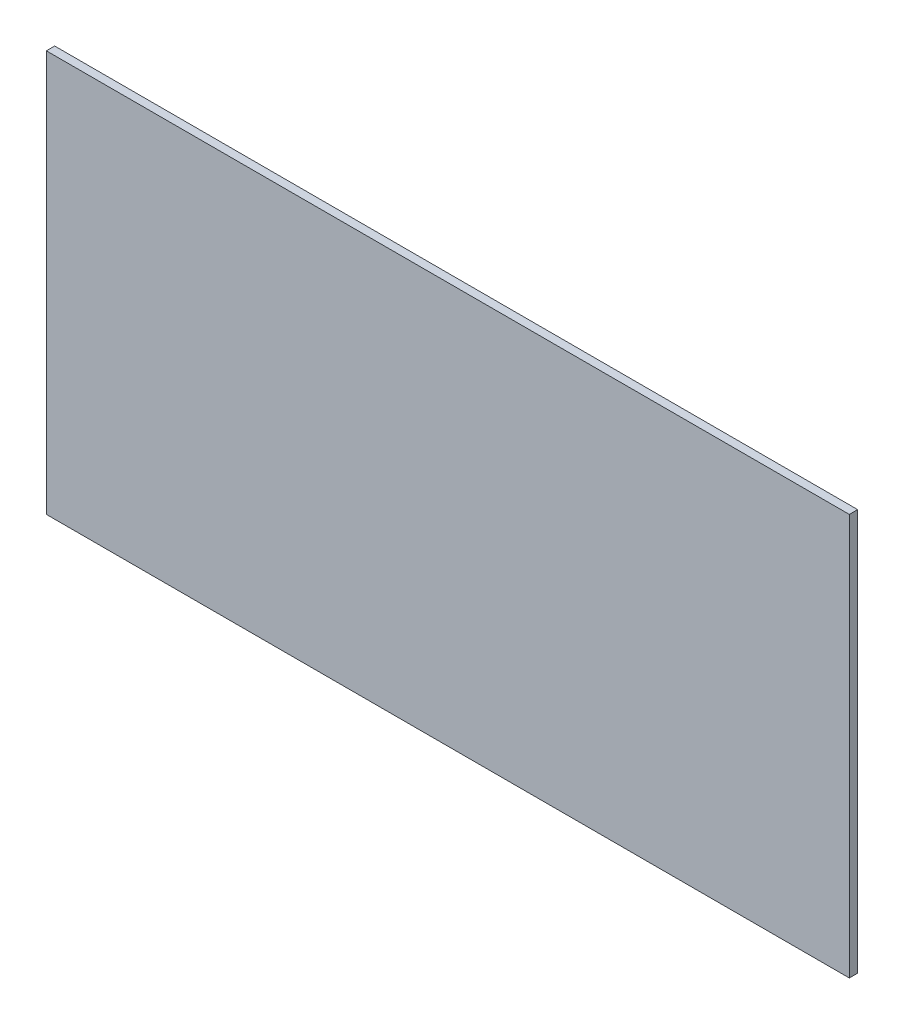
ISO-10303-21;
HEADER;
FILE_DESCRIPTION(('STEP AP214'),'2;1');
FILE_NAME('part.step','',(''),(''),'','','');
FILE_SCHEMA(('AUTOMOTIVE_DESIGN { 1 0 10303 214 1 1 1 1 }'));
ENDSEC;
DATA;
#1=APPLICATION_CONTEXT('core data for automotive mechanical design processes');
#2=APPLICATION_PROTOCOL_DEFINITION('international standard','automotive_design',2000,#1);
#3=PRODUCT_CONTEXT('',#1,'mechanical');
#4=PRODUCT('Part','Part','',(#3));
#5=PRODUCT_RELATED_PRODUCT_CATEGORY('part','',(#4));
#6=PRODUCT_DEFINITION_FORMATION('','',#4);
#7=PRODUCT_DEFINITION_CONTEXT('part definition',#1,'design');
#8=PRODUCT_DEFINITION('design','',#6,#7);
#9=PRODUCT_DEFINITION_SHAPE('','',#8);
#10=(LENGTH_UNIT() NAMED_UNIT(*) SI_UNIT(.MILLI.,.METRE.));
#11=(NAMED_UNIT(*) PLANE_ANGLE_UNIT() SI_UNIT($,.RADIAN.));
#12=(NAMED_UNIT(*) SI_UNIT($,.STERADIAN.) SOLID_ANGLE_UNIT());
#13=UNCERTAINTY_MEASURE_WITH_UNIT(LENGTH_MEASURE(1.E-05),#10,'distance_accuracy_value','');
#14=(GEOMETRIC_REPRESENTATION_CONTEXT(3) GLOBAL_UNCERTAINTY_ASSIGNED_CONTEXT((#13)) GLOBAL_UNIT_ASSIGNED_CONTEXT((#10,
#11,#12)) REPRESENTATION_CONTEXT('',''));
#15=CARTESIAN_POINT('',(0.,0.,0.));
#16=DIRECTION('',(0.,0.,1.));
#17=DIRECTION('',(1.,0.,0.));
#18=AXIS2_PLACEMENT_3D('',#15,#16,#17);
#19=CARTESIAN_POINT('',(304.,-152.,6.3));
#20=DIRECTION('',(-1.,0.,0.));
#21=DIRECTION('',(0.,0.,1.));
#22=AXIS2_PLACEMENT_3D('',#19,#20,#21);
#23=PLANE('',#22);
#24=DIRECTION('',(0.,1.,0.));
#25=VECTOR('',#24,1.);
#26=CARTESIAN_POINT('',(304.,-152.,0.));
#27=LINE('',#26,#25);
#28=CARTESIAN_POINT('',(304.,-152.,0.));
#29=VERTEX_POINT('',#28);
#30=CARTESIAN_POINT('',(304.,152.,0.));
#31=VERTEX_POINT('',#30);
#32=EDGE_CURVE('E96',#29,#31,#27,.T.);
#33=ORIENTED_EDGE('',*,*,#32,.T.);
#34=DIRECTION('',(0.,0.,-1.));
#35=VECTOR('',#34,1.);
#36=CARTESIAN_POINT('',(304.,152.,6.3));
#37=LINE('',#36,#35);
#38=CARTESIAN_POINT('',(304.,152.,6.3));
#39=VERTEX_POINT('',#38);
#40=EDGE_CURVE('E11',#39,#31,#37,.T.);
#41=ORIENTED_EDGE('',*,*,#40,.F.);
#42=DIRECTION('',(0.,1.,0.));
#43=VECTOR('',#42,1.);
#44=CARTESIAN_POINT('',(304.,-152.,6.3));
#45=LINE('',#44,#43);
#46=CARTESIAN_POINT('',(304.,-152.,6.3));
#47=VERTEX_POINT('',#46);
#48=EDGE_CURVE('E84',#47,#39,#45,.T.);
#49=ORIENTED_EDGE('',*,*,#48,.F.);
#50=DIRECTION('',(0.,0.,-1.));
#51=VECTOR('',#50,1.);
#52=CARTESIAN_POINT('',(304.,-152.,6.3));
#53=LINE('',#52,#51);
#54=EDGE_CURVE('E92',#47,#29,#53,.T.);
#55=ORIENTED_EDGE('',*,*,#54,.T.);
#56=EDGE_LOOP('',(#33,#41,#49,#55));
#57=FACE_BOUND('',#56,.T.);
#58=ADVANCED_FACE('F33',(#57),#23,.F.);
#59=CARTESIAN_POINT('',(-304.,152.,6.3));
#60=DIRECTION('',(0.,-1.,0.));
#61=DIRECTION('',(0.,0.,-1.));
#62=AXIS2_PLACEMENT_3D('',#59,#60,#61);
#63=PLANE('',#62);
#64=DIRECTION('',(-1.,0.,0.));
#65=VECTOR('',#64,1.);
#66=CARTESIAN_POINT('',(-304.,152.,0.));
#67=LINE('',#66,#65);
#68=CARTESIAN_POINT('',(-304.,152.,0.));
#69=VERTEX_POINT('',#68);
#70=EDGE_CURVE('E88',#31,#69,#67,.T.);
#71=ORIENTED_EDGE('',*,*,#70,.T.);
#72=DIRECTION('',(0.,0.,-1.));
#73=VECTOR('',#72,1.);
#74=CARTESIAN_POINT('',(-304.,152.,6.3));
#75=LINE('',#74,#73);
#76=CARTESIAN_POINT('',(-304.,152.,6.3));
#77=VERTEX_POINT('',#76);
#78=EDGE_CURVE('E41',#77,#69,#75,.T.);
#79=ORIENTED_EDGE('',*,*,#78,.F.);
#80=DIRECTION('',(-1.,0.,0.));
#81=VECTOR('',#80,1.);
#82=CARTESIAN_POINT('',(-304.,152.,6.3));
#83=LINE('',#82,#81);
#84=EDGE_CURVE('E79',#39,#77,#83,.T.);
#85=ORIENTED_EDGE('',*,*,#84,.F.);
#86=ORIENTED_EDGE('',*,*,#40,.T.);
#87=EDGE_LOOP('',(#71,#79,#85,#86));
#88=FACE_BOUND('',#87,.T.);
#89=ADVANCED_FACE('F87',(#88),#63,.F.);
#90=CARTESIAN_POINT('',(-304.,-152.,6.3));
#91=DIRECTION('',(1.,0.,0.));
#92=DIRECTION('',(0.,0.,-1.));
#93=AXIS2_PLACEMENT_3D('',#90,#91,#92);
#94=PLANE('',#93);
#95=DIRECTION('',(0.,-1.,0.));
#96=VECTOR('',#95,1.);
#97=CARTESIAN_POINT('',(-304.,-152.,0.));
#98=LINE('',#97,#96);
#99=CARTESIAN_POINT('',(-304.,-152.,0.));
#100=VERTEX_POINT('',#99);
#101=EDGE_CURVE('E66',#69,#100,#98,.T.);
#102=ORIENTED_EDGE('',*,*,#101,.T.);
#103=DIRECTION('',(0.,0.,-1.));
#104=VECTOR('',#103,1.);
#105=CARTESIAN_POINT('',(-304.,-152.,6.3));
#106=LINE('',#105,#104);
#107=CARTESIAN_POINT('',(-304.,-152.,6.3));
#108=VERTEX_POINT('',#107);
#109=EDGE_CURVE('E89',#108,#100,#106,.T.);
#110=ORIENTED_EDGE('',*,*,#109,.F.);
#111=DIRECTION('',(0.,-1.,0.));
#112=VECTOR('',#111,1.);
#113=CARTESIAN_POINT('',(-304.,-152.,6.3));
#114=LINE('',#113,#112);
#115=EDGE_CURVE('E82',#77,#108,#114,.T.);
#116=ORIENTED_EDGE('',*,*,#115,.F.);
#117=ORIENTED_EDGE('',*,*,#78,.T.);
#118=EDGE_LOOP('',(#102,#110,#116,#117));
#119=FACE_BOUND('',#118,.T.);
#120=ADVANCED_FACE('F90',(#119),#94,.F.);
#121=CARTESIAN_POINT('',(-304.,-152.,6.3));
#122=DIRECTION('',(0.,1.,0.));
#123=DIRECTION('',(0.,0.,1.));
#124=AXIS2_PLACEMENT_3D('',#121,#122,#123);
#125=PLANE('',#124);
#126=DIRECTION('',(1.,0.,0.));
#127=VECTOR('',#126,1.);
#128=CARTESIAN_POINT('',(-304.,-152.,0.));
#129=LINE('',#128,#127);
#130=EDGE_CURVE('E72',#100,#29,#129,.T.);
#131=ORIENTED_EDGE('',*,*,#130,.T.);
#132=ORIENTED_EDGE('',*,*,#54,.F.);
#133=DIRECTION('',(1.,0.,0.));
#134=VECTOR('',#133,1.);
#135=CARTESIAN_POINT('',(-304.,-152.,6.3));
#136=LINE('',#135,#134);
#137=EDGE_CURVE('E49',#108,#47,#136,.T.);
#138=ORIENTED_EDGE('',*,*,#137,.F.);
#139=ORIENTED_EDGE('',*,*,#109,.T.);
#140=EDGE_LOOP('',(#131,#132,#138,#139));
#141=FACE_BOUND('',#140,.T.);
#142=ADVANCED_FACE('F103',(#141),#125,.F.);
#143=CARTESIAN_POINT('',(0.,0.,6.3));
#144=DIRECTION('',(0.,0.,-1.));
#145=DIRECTION('',(-1.,0.,0.));
#146=AXIS2_PLACEMENT_3D('',#143,#144,#145);
#147=PLANE('',#146);
#148=ORIENTED_EDGE('',*,*,#48,.T.);
#149=ORIENTED_EDGE('',*,*,#84,.T.);
#150=ORIENTED_EDGE('',*,*,#115,.T.);
#151=ORIENTED_EDGE('',*,*,#137,.T.);
#152=EDGE_LOOP('',(#148,#149,#150,#151));
#153=FACE_BOUND('',#152,.T.);
#154=ADVANCED_FACE('F80',(#153),#147,.F.);
#155=CARTESIAN_POINT('',(0.,0.,0.));
#156=DIRECTION('',(0.,0.,-1.));
#157=DIRECTION('',(-1.,0.,0.));
#158=AXIS2_PLACEMENT_3D('',#155,#156,#157);
#159=PLANE('',#158);
#160=ORIENTED_EDGE('',*,*,#32,.F.);
#161=ORIENTED_EDGE('',*,*,#130,.F.);
#162=ORIENTED_EDGE('',*,*,#101,.F.);
#163=ORIENTED_EDGE('',*,*,#70,.F.);
#164=EDGE_LOOP('',(#160,#161,#162,#163));
#165=FACE_BOUND('',#164,.T.);
#166=ADVANCED_FACE('F106',(#165),#159,.T.);
#167=CLOSED_SHELL('',(#58,#89,#120,#142,#154,#166));
#168=MANIFOLD_SOLID_BREP('B2',#167);
#169=ADVANCED_BREP_SHAPE_REPRESENTATION('',(#18,#168),#14);
#170=SHAPE_DEFINITION_REPRESENTATION(#9,#169);
ENDSEC;
END-ISO-10303-21;
